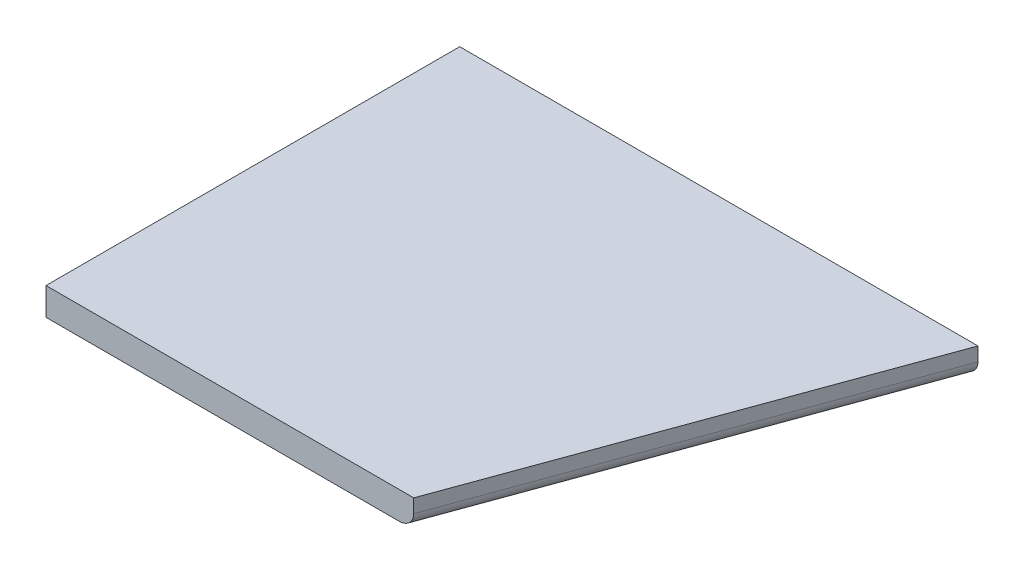
ISO-10303-21;
HEADER;
FILE_DESCRIPTION(('STEP AP214'),'2;1');
FILE_NAME('part.step','',(''),(''),'','','');
FILE_SCHEMA(('AUTOMOTIVE_DESIGN { 1 0 10303 214 1 1 1 1 }'));
ENDSEC;
DATA;
#1=APPLICATION_CONTEXT('core data for automotive mechanical design processes');
#2=APPLICATION_PROTOCOL_DEFINITION('international standard','automotive_design',2000,#1);
#3=PRODUCT_CONTEXT('',#1,'mechanical');
#4=PRODUCT('Part','Part','',(#3));
#5=PRODUCT_RELATED_PRODUCT_CATEGORY('part','',(#4));
#6=PRODUCT_DEFINITION_FORMATION('','',#4);
#7=PRODUCT_DEFINITION_CONTEXT('part definition',#1,'design');
#8=PRODUCT_DEFINITION('design','',#6,#7);
#9=PRODUCT_DEFINITION_SHAPE('','',#8);
#10=(LENGTH_UNIT() NAMED_UNIT(*) SI_UNIT(.MILLI.,.METRE.));
#11=(NAMED_UNIT(*) PLANE_ANGLE_UNIT() SI_UNIT($,.RADIAN.));
#12=(NAMED_UNIT(*) SI_UNIT($,.STERADIAN.) SOLID_ANGLE_UNIT());
#13=UNCERTAINTY_MEASURE_WITH_UNIT(LENGTH_MEASURE(1.E-05),#10,'distance_accuracy_value','');
#14=(GEOMETRIC_REPRESENTATION_CONTEXT(3) GLOBAL_UNCERTAINTY_ASSIGNED_CONTEXT((#13)) GLOBAL_UNIT_ASSIGNED_CONTEXT((#10,
#11,#12)) REPRESENTATION_CONTEXT('',''));
#15=CARTESIAN_POINT('',(0.,0.,0.));
#16=DIRECTION('',(0.,0.,1.));
#17=DIRECTION('',(1.,0.,0.));
#18=AXIS2_PLACEMENT_3D('',#15,#16,#17);
#19=CARTESIAN_POINT('',(0.,6.,0.));
#20=DIRECTION('',(0.,0.,-1.));
#21=DIRECTION('',(-1.,0.,0.));
#22=AXIS2_PLACEMENT_3D('',#19,#20,#21);
#23=PLANE('',#22);
#24=DIRECTION('',(1.,0.,0.));
#25=VECTOR('',#24,1.);
#26=CARTESIAN_POINT('',(0.,0.,0.));
#27=LINE('',#26,#25);
#28=CARTESIAN_POINT('',(-80.,0.,0.));
#29=VERTEX_POINT('',#28);
#30=CARTESIAN_POINT('',(-3.19253331742774,0.,0.));
#31=VERTEX_POINT('',#30);
#32=EDGE_CURVE('E138',#29,#31,#27,.T.);
#33=ORIENTED_EDGE('',*,*,#32,.T.);
#34=CARTESIAN_POINT('',(-3.19253331742774,3.,0.));
#35=DIRECTION('',(0.,0.,-1.));
#36=DIRECTION('',(-1.,0.,0.));
#37=AXIS2_PLACEMENT_3D('',#34,#35,#36);
#38=ELLIPSE('',#37,3.19253331742774,3.);
#39=CARTESIAN_POINT('',(0.,3.,0.));
#40=VERTEX_POINT('',#39);
#41=EDGE_CURVE('E11',#31,#40,#38,.F.);
#42=ORIENTED_EDGE('',*,*,#41,.T.);
#43=DIRECTION('',(0.,-1.,0.));
#44=VECTOR('',#43,1.);
#45=CARTESIAN_POINT('',(0.,6.,0.));
#46=LINE('',#45,#44);
#47=CARTESIAN_POINT('',(0.,6.,0.));
#48=VERTEX_POINT('',#47);
#49=EDGE_CURVE('E95',#48,#40,#46,.T.);
#50=ORIENTED_EDGE('',*,*,#49,.F.);
#51=DIRECTION('',(1.,0.,0.));
#52=VECTOR('',#51,1.);
#53=CARTESIAN_POINT('',(0.,6.,0.));
#54=LINE('',#53,#52);
#55=CARTESIAN_POINT('',(-80.,6.,0.));
#56=VERTEX_POINT('',#55);
#57=EDGE_CURVE('E102',#56,#48,#54,.T.);
#58=ORIENTED_EDGE('',*,*,#57,.F.);
#59=DIRECTION('',(0.,-1.,0.));
#60=VECTOR('',#59,1.);
#61=CARTESIAN_POINT('',(-80.,6.,0.));
#62=LINE('',#61,#60);
#63=EDGE_CURVE('E130',#56,#29,#62,.T.);
#64=ORIENTED_EDGE('',*,*,#63,.T.);
#65=EDGE_LOOP('',(#33,#42,#50,#58,#64));
#66=FACE_BOUND('',#65,.T.);
#67=ADVANCED_FACE('F43',(#66),#23,.F.);
#68=CARTESIAN_POINT('',(0.,6.,0.));
#69=DIRECTION('',(-0.939692620785907,0.,-0.342020143325672));
#70=DIRECTION('',(-0.342020143325672,0.,0.939692620785907));
#71=AXIS2_PLACEMENT_3D('',#68,#69,#70);
#72=PLANE('',#71);
#73=ORIENTED_EDGE('',*,*,#49,.T.);
#74=DIRECTION('',(0.342020143325672,0.,-0.939692620785907));
#75=VECTOR('',#74,1.);
#76=CARTESIAN_POINT('',(32.7573210839586,3.,-90.));
#77=LINE('',#76,#75);
#78=CARTESIAN_POINT('',(32.7573210839586,3.,-90.));
#79=VERTEX_POINT('',#78);
#80=EDGE_CURVE('E116',#40,#79,#77,.T.);
#81=ORIENTED_EDGE('',*,*,#80,.T.);
#82=DIRECTION('',(0.,-1.,0.));
#83=VECTOR('',#82,1.);
#84=CARTESIAN_POINT('',(32.7573210839586,6.,-90.));
#85=LINE('',#84,#83);
#86=CARTESIAN_POINT('',(32.7573210839586,6.,-90.));
#87=VERTEX_POINT('',#86);
#88=EDGE_CURVE('E97',#87,#79,#85,.T.);
#89=ORIENTED_EDGE('',*,*,#88,.F.);
#90=DIRECTION('',(0.342020143325672,0.,-0.939692620785907));
#91=VECTOR('',#90,1.);
#92=CARTESIAN_POINT('',(0.,6.,0.));
#93=LINE('',#92,#91);
#94=EDGE_CURVE('E90',#48,#87,#93,.T.);
#95=ORIENTED_EDGE('',*,*,#94,.F.);
#96=EDGE_LOOP('',(#73,#81,#89,#95));
#97=FACE_BOUND('',#96,.T.);
#98=ADVANCED_FACE('F92',(#97),#72,.F.);
#99=CARTESIAN_POINT('',(0.,6.,-90.));
#100=DIRECTION('',(0.,0.,1.));
#101=DIRECTION('',(1.,0.,0.));
#102=AXIS2_PLACEMENT_3D('',#99,#100,#101);
#103=PLANE('',#102);
#104=ORIENTED_EDGE('',*,*,#88,.T.);
#105=CARTESIAN_POINT('',(29.5647877665309,3.,-90.));
#106=DIRECTION('',(0.,0.,1.));
#107=DIRECTION('',(-1.,0.,0.));
#108=AXIS2_PLACEMENT_3D('',#105,#106,#107);
#109=ELLIPSE('',#108,3.19253331742774,3.);
#110=CARTESIAN_POINT('',(29.5647877665309,0.,-90.));
#111=VERTEX_POINT('',#110);
#112=EDGE_CURVE('E66',#79,#111,#109,.F.);
#113=ORIENTED_EDGE('',*,*,#112,.T.);
#114=DIRECTION('',(-1.,0.,0.));
#115=VECTOR('',#114,1.);
#116=CARTESIAN_POINT('',(0.,0.,-90.));
#117=LINE('',#116,#115);
#118=CARTESIAN_POINT('',(-80.,0.,-90.));
#119=VERTEX_POINT('',#118);
#120=EDGE_CURVE('E135',#111,#119,#117,.T.);
#121=ORIENTED_EDGE('',*,*,#120,.T.);
#122=DIRECTION('',(0.,-1.,0.));
#123=VECTOR('',#122,1.);
#124=CARTESIAN_POINT('',(-80.,6.,-90.));
#125=LINE('',#124,#123);
#126=CARTESIAN_POINT('',(-80.,6.,-90.));
#127=VERTEX_POINT('',#126);
#128=EDGE_CURVE('E121',#127,#119,#125,.T.);
#129=ORIENTED_EDGE('',*,*,#128,.F.);
#130=DIRECTION('',(-1.,0.,0.));
#131=VECTOR('',#130,1.);
#132=CARTESIAN_POINT('',(32.7573210839586,6.,-90.));
#133=LINE('',#132,#131);
#134=EDGE_CURVE('E101',#87,#127,#133,.T.);
#135=ORIENTED_EDGE('',*,*,#134,.F.);
#136=EDGE_LOOP('',(#104,#113,#121,#129,#135));
#137=FACE_BOUND('',#136,.T.);
#138=ADVANCED_FACE('F145',(#137),#103,.F.);
#139=CARTESIAN_POINT('',(-80.,6.,0.));
#140=DIRECTION('',(1.,0.,0.));
#141=DIRECTION('',(0.,0.,-1.));
#142=AXIS2_PLACEMENT_3D('',#139,#140,#141);
#143=PLANE('',#142);
#144=DIRECTION('',(0.,0.,1.));
#145=VECTOR('',#144,1.);
#146=CARTESIAN_POINT('',(-80.,0.,0.));
#147=LINE('',#146,#145);
#148=EDGE_CURVE('E112',#119,#29,#147,.T.);
#149=ORIENTED_EDGE('',*,*,#148,.T.);
#150=ORIENTED_EDGE('',*,*,#63,.F.);
#151=DIRECTION('',(0.,0.,1.));
#152=VECTOR('',#151,1.);
#153=CARTESIAN_POINT('',(-80.,6.,0.));
#154=LINE('',#153,#152);
#155=EDGE_CURVE('E107',#127,#56,#154,.T.);
#156=ORIENTED_EDGE('',*,*,#155,.F.);
#157=ORIENTED_EDGE('',*,*,#128,.T.);
#158=EDGE_LOOP('',(#149,#150,#156,#157));
#159=FACE_BOUND('',#158,.T.);
#160=ADVANCED_FACE('F148',(#159),#143,.F.);
#161=CARTESIAN_POINT('',(0.,6.,0.));
#162=DIRECTION('',(0.,-1.,0.));
#163=DIRECTION('',(0.,0.,-1.));
#164=AXIS2_PLACEMENT_3D('',#161,#162,#163);
#165=PLANE('',#164);
#166=ORIENTED_EDGE('',*,*,#57,.T.);
#167=ORIENTED_EDGE('',*,*,#94,.T.);
#168=ORIENTED_EDGE('',*,*,#134,.T.);
#169=ORIENTED_EDGE('',*,*,#155,.T.);
#170=EDGE_LOOP('',(#166,#167,#168,#169));
#171=FACE_BOUND('',#170,.T.);
#172=ADVANCED_FACE('F105',(#171),#165,.F.);
#173=CARTESIAN_POINT('',(0.,0.,0.));
#174=DIRECTION('',(0.,-1.,0.));
#175=DIRECTION('',(0.,0.,-1.));
#176=AXIS2_PLACEMENT_3D('',#173,#174,#175);
#177=PLANE('',#176);
#178=ORIENTED_EDGE('',*,*,#120,.F.);
#179=DIRECTION('',(0.342020143325672,0.,-0.939692620785907));
#180=VECTOR('',#179,1.);
#181=CARTESIAN_POINT('',(-2.81907786235772,0.,-1.02606042997702));
#182=LINE('',#181,#180);
#183=EDGE_CURVE('E52',#111,#31,#182,.F.);
#184=ORIENTED_EDGE('',*,*,#183,.T.);
#185=ORIENTED_EDGE('',*,*,#32,.F.);
#186=ORIENTED_EDGE('',*,*,#148,.F.);
#187=EDGE_LOOP('',(#178,#184,#185,#186));
#188=FACE_BOUND('',#187,.T.);
#189=ADVANCED_FACE('F149',(#188),#177,.T.);
#190=CARTESIAN_POINT('',(-2.81907786235772,3.,-1.02606042997702));
#191=DIRECTION('',(-0.342020143325672,0.,0.939692620785907));
#192=DIRECTION('',(0.939692620785907,0.,0.342020143325672));
#193=AXIS2_PLACEMENT_3D('',#190,#191,#192);
#194=CYLINDRICAL_SURFACE('',#193,3.);
#195=ORIENTED_EDGE('',*,*,#41,.F.);
#196=ORIENTED_EDGE('',*,*,#183,.F.);
#197=ORIENTED_EDGE('',*,*,#112,.F.);
#198=ORIENTED_EDGE('',*,*,#80,.F.);
#199=EDGE_LOOP('',(#195,#196,#197,#198));
#200=FACE_BOUND('',#199,.T.);
#201=ADVANCED_FACE('F45',(#200),#194,.T.);
#202=CLOSED_SHELL('',(#67,#98,#138,#160,#172,#189,#201));
#203=MANIFOLD_SOLID_BREP('B2',#202);
#204=ADVANCED_BREP_SHAPE_REPRESENTATION('',(#18,#203),#14);
#205=SHAPE_DEFINITION_REPRESENTATION(#9,#204);
ENDSEC;
END-ISO-10303-21;
